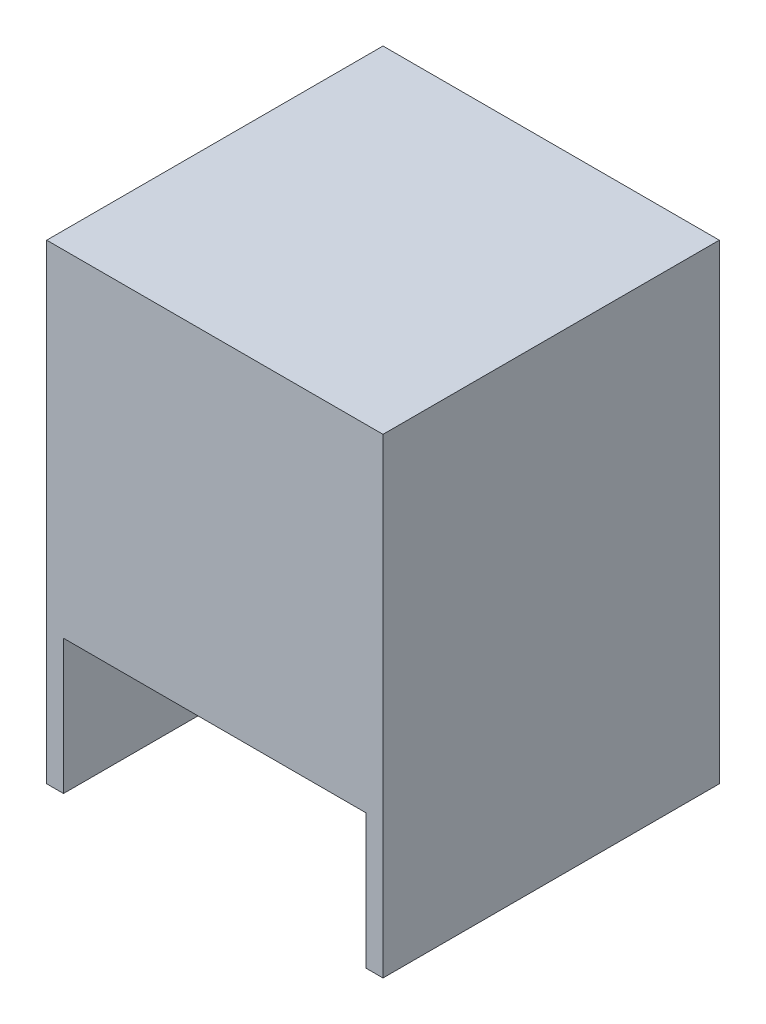
ISO-10303-21;
HEADER;
FILE_DESCRIPTION(('STEP AP214'),'2;1');
FILE_NAME('part.step','',(''),(''),'','','');
FILE_SCHEMA(('AUTOMOTIVE_DESIGN { 1 0 10303 214 1 1 1 1 }'));
ENDSEC;
DATA;
#1=APPLICATION_CONTEXT('core data for automotive mechanical design processes');
#2=APPLICATION_PROTOCOL_DEFINITION('international standard','automotive_design',2000,#1);
#3=PRODUCT_CONTEXT('',#1,'mechanical');
#4=PRODUCT('Part','Part','',(#3));
#5=PRODUCT_RELATED_PRODUCT_CATEGORY('part','',(#4));
#6=PRODUCT_DEFINITION_FORMATION('','',#4);
#7=PRODUCT_DEFINITION_CONTEXT('part definition',#1,'design');
#8=PRODUCT_DEFINITION('design','',#6,#7);
#9=PRODUCT_DEFINITION_SHAPE('','',#8);
#10=(LENGTH_UNIT() NAMED_UNIT(*) SI_UNIT(.MILLI.,.METRE.));
#11=(NAMED_UNIT(*) PLANE_ANGLE_UNIT() SI_UNIT($,.RADIAN.));
#12=(NAMED_UNIT(*) SI_UNIT($,.STERADIAN.) SOLID_ANGLE_UNIT());
#13=UNCERTAINTY_MEASURE_WITH_UNIT(LENGTH_MEASURE(1.E-05),#10,'distance_accuracy_value','');
#14=(GEOMETRIC_REPRESENTATION_CONTEXT(3) GLOBAL_UNCERTAINTY_ASSIGNED_CONTEXT((#13)) GLOBAL_UNIT_ASSIGNED_CONTEXT((#10,
#11,#12)) REPRESENTATION_CONTEXT('',''));
#15=CARTESIAN_POINT('',(0.,0.,0.));
#16=DIRECTION('',(0.,0.,1.));
#17=DIRECTION('',(1.,0.,0.));
#18=AXIS2_PLACEMENT_3D('',#15,#16,#17);
#19=CARTESIAN_POINT('',(0.,0.,0.));
#20=DIRECTION('',(0.,1.,0.));
#21=DIRECTION('',(0.,0.,1.));
#22=AXIS2_PLACEMENT_3D('',#19,#20,#21);
#23=PLANE('',#22);
#24=DIRECTION('',(0.,0.,-1.));
#25=VECTOR('',#24,1.);
#26=CARTESIAN_POINT('',(450.,0.,500.));
#27=LINE('',#26,#25);
#28=CARTESIAN_POINT('',(450.,0.,500.));
#29=VERTEX_POINT('',#28);
#30=CARTESIAN_POINT('',(450.,0.,-500.));
#31=VERTEX_POINT('',#30);
#32=EDGE_CURVE('E122',#29,#31,#27,.T.);
#33=ORIENTED_EDGE('',*,*,#32,.F.);
#34=DIRECTION('',(1.,0.,0.));
#35=VECTOR('',#34,1.);
#36=CARTESIAN_POINT('',(-500.,0.,500.));
#37=LINE('',#36,#35);
#38=CARTESIAN_POINT('',(-450.,0.,500.));
#39=VERTEX_POINT('',#38);
#40=EDGE_CURVE('E152',#39,#29,#37,.T.);
#41=ORIENTED_EDGE('',*,*,#40,.F.);
#42=DIRECTION('',(0.,0.,1.));
#43=VECTOR('',#42,1.);
#44=CARTESIAN_POINT('',(-450.,0.,500.));
#45=LINE('',#44,#43);
#46=CARTESIAN_POINT('',(-450.,0.,-500.));
#47=VERTEX_POINT('',#46);
#48=EDGE_CURVE('E131',#47,#39,#45,.T.);
#49=ORIENTED_EDGE('',*,*,#48,.F.);
#50=DIRECTION('',(-1.,0.,0.));
#51=VECTOR('',#50,1.);
#52=CARTESIAN_POINT('',(-500.,0.,-500.));
#53=LINE('',#52,#51);
#54=EDGE_CURVE('E48',#31,#47,#53,.T.);
#55=ORIENTED_EDGE('',*,*,#54,.F.);
#56=EDGE_LOOP('',(#33,#41,#49,#55));
#57=FACE_BOUND('',#56,.T.);
#58=ADVANCED_FACE('F33',(#57),#23,.F.);
#59=CARTESIAN_POINT('',(500.,1000.,-500.));
#60=DIRECTION('',(-1.,0.,0.));
#61=DIRECTION('',(0.,0.,1.));
#62=AXIS2_PLACEMENT_3D('',#59,#60,#61);
#63=PLANE('',#62);
#64=DIRECTION('',(0.,-1.,0.));
#65=VECTOR('',#64,1.);
#66=CARTESIAN_POINT('',(500.,1000.,500.));
#67=LINE('',#66,#65);
#68=CARTESIAN_POINT('',(500.,1000.,500.));
#69=VERTEX_POINT('',#68);
#70=CARTESIAN_POINT('',(500.,-400.,500.));
#71=VERTEX_POINT('',#70);
#72=EDGE_CURVE('E100',#69,#71,#67,.T.);
#73=ORIENTED_EDGE('',*,*,#72,.T.);
#74=DIRECTION('',(0.,0.,1.));
#75=VECTOR('',#74,1.);
#76=CARTESIAN_POINT('',(500.,-400.,500.));
#77=LINE('',#76,#75);
#78=CARTESIAN_POINT('',(500.,-400.,-500.));
#79=VERTEX_POINT('',#78);
#80=EDGE_CURVE('E104',#79,#71,#77,.T.);
#81=ORIENTED_EDGE('',*,*,#80,.F.);
#82=DIRECTION('',(0.,-1.,0.));
#83=VECTOR('',#82,1.);
#84=CARTESIAN_POINT('',(500.,1000.,-500.));
#85=LINE('',#84,#83);
#86=CARTESIAN_POINT('',(500.,1000.,-500.));
#87=VERTEX_POINT('',#86);
#88=EDGE_CURVE('E11',#87,#79,#85,.T.);
#89=ORIENTED_EDGE('',*,*,#88,.F.);
#90=DIRECTION('',(0.,0.,-1.));
#91=VECTOR('',#90,1.);
#92=CARTESIAN_POINT('',(500.,1000.,-500.));
#93=LINE('',#92,#91);
#94=EDGE_CURVE('E105',#69,#87,#93,.T.);
#95=ORIENTED_EDGE('',*,*,#94,.F.);
#96=EDGE_LOOP('',(#73,#81,#89,#95));
#97=FACE_BOUND('',#96,.T.);
#98=ADVANCED_FACE('F35',(#97),#63,.F.);
#99=CARTESIAN_POINT('',(-500.,1000.,-500.));
#100=DIRECTION('',(0.,0.,1.));
#101=DIRECTION('',(1.,0.,0.));
#102=AXIS2_PLACEMENT_3D('',#99,#100,#101);
#103=PLANE('',#102);
#104=ORIENTED_EDGE('',*,*,#88,.T.);
#105=DIRECTION('',(1.,0.,0.));
#106=VECTOR('',#105,1.);
#107=CARTESIAN_POINT('',(500.,-400.,-500.));
#108=LINE('',#107,#106);
#109=CARTESIAN_POINT('',(450.,-400.,-500.));
#110=VERTEX_POINT('',#109);
#111=EDGE_CURVE('E121',#110,#79,#108,.T.);
#112=ORIENTED_EDGE('',*,*,#111,.F.);
#113=DIRECTION('',(0.,1.,0.));
#114=VECTOR('',#113,1.);
#115=CARTESIAN_POINT('',(450.,-400.,-500.));
#116=LINE('',#115,#114);
#117=EDGE_CURVE('E127',#110,#31,#116,.T.);
#118=ORIENTED_EDGE('',*,*,#117,.T.);
#119=ORIENTED_EDGE('',*,*,#54,.T.);
#120=DIRECTION('',(0.,1.,0.));
#121=VECTOR('',#120,1.);
#122=CARTESIAN_POINT('',(-450.,-400.,-500.));
#123=LINE('',#122,#121);
#124=CARTESIAN_POINT('',(-450.,-400.,-500.));
#125=VERTEX_POINT('',#124);
#126=EDGE_CURVE('E147',#125,#47,#123,.T.);
#127=ORIENTED_EDGE('',*,*,#126,.F.);
#128=DIRECTION('',(1.,0.,0.));
#129=VECTOR('',#128,1.);
#130=CARTESIAN_POINT('',(-500.,-400.,-500.));
#131=LINE('',#130,#129);
#132=CARTESIAN_POINT('',(-500.,-400.,-500.));
#133=VERTEX_POINT('',#132);
#134=EDGE_CURVE('E135',#133,#125,#131,.T.);
#135=ORIENTED_EDGE('',*,*,#134,.F.);
#136=DIRECTION('',(0.,-1.,0.));
#137=VECTOR('',#136,1.);
#138=CARTESIAN_POINT('',(-500.,1000.,-500.));
#139=LINE('',#138,#137);
#140=CARTESIAN_POINT('',(-500.,1000.,-500.));
#141=VERTEX_POINT('',#140);
#142=EDGE_CURVE('E41',#141,#133,#139,.T.);
#143=ORIENTED_EDGE('',*,*,#142,.F.);
#144=DIRECTION('',(-1.,0.,0.));
#145=VECTOR('',#144,1.);
#146=CARTESIAN_POINT('',(-500.,1000.,-500.));
#147=LINE('',#146,#145);
#148=EDGE_CURVE('E151',#87,#141,#147,.T.);
#149=ORIENTED_EDGE('',*,*,#148,.F.);
#150=EDGE_LOOP('',(#104,#112,#118,#119,#127,#135,#143,#149));
#151=FACE_BOUND('',#150,.T.);
#152=ADVANCED_FACE('F166',(#151),#103,.F.);
#153=CARTESIAN_POINT('',(-500.,1000.,-500.));
#154=DIRECTION('',(1.,0.,0.));
#155=DIRECTION('',(0.,0.,-1.));
#156=AXIS2_PLACEMENT_3D('',#153,#154,#155);
#157=PLANE('',#156);
#158=ORIENTED_EDGE('',*,*,#142,.T.);
#159=DIRECTION('',(0.,0.,-1.));
#160=VECTOR('',#159,1.);
#161=CARTESIAN_POINT('',(-500.,-400.,500.));
#162=LINE('',#161,#160);
#163=CARTESIAN_POINT('',(-500.,-400.,500.));
#164=VERTEX_POINT('',#163);
#165=EDGE_CURVE('E132',#164,#133,#162,.T.);
#166=ORIENTED_EDGE('',*,*,#165,.F.);
#167=DIRECTION('',(0.,-1.,0.));
#168=VECTOR('',#167,1.);
#169=CARTESIAN_POINT('',(-500.,1000.,500.));
#170=LINE('',#169,#168);
#171=CARTESIAN_POINT('',(-500.,1000.,500.));
#172=VERTEX_POINT('',#171);
#173=EDGE_CURVE('E107',#172,#164,#170,.T.);
#174=ORIENTED_EDGE('',*,*,#173,.F.);
#175=DIRECTION('',(0.,0.,1.));
#176=VECTOR('',#175,1.);
#177=CARTESIAN_POINT('',(-500.,1000.,-500.));
#178=LINE('',#177,#176);
#179=EDGE_CURVE('E154',#141,#172,#178,.T.);
#180=ORIENTED_EDGE('',*,*,#179,.F.);
#181=EDGE_LOOP('',(#158,#166,#174,#180));
#182=FACE_BOUND('',#181,.T.);
#183=ADVANCED_FACE('F164',(#182),#157,.F.);
#184=CARTESIAN_POINT('',(-500.,1000.,500.));
#185=DIRECTION('',(0.,0.,-1.));
#186=DIRECTION('',(-1.,0.,0.));
#187=AXIS2_PLACEMENT_3D('',#184,#185,#186);
#188=PLANE('',#187);
#189=ORIENTED_EDGE('',*,*,#173,.T.);
#190=DIRECTION('',(-1.,0.,0.));
#191=VECTOR('',#190,1.);
#192=CARTESIAN_POINT('',(-500.,-400.,500.));
#193=LINE('',#192,#191);
#194=CARTESIAN_POINT('',(-450.,-400.,500.));
#195=VERTEX_POINT('',#194);
#196=EDGE_CURVE('E139',#195,#164,#193,.T.);
#197=ORIENTED_EDGE('',*,*,#196,.F.);
#198=DIRECTION('',(0.,1.,0.));
#199=VECTOR('',#198,1.);
#200=CARTESIAN_POINT('',(-450.,-400.,500.));
#201=LINE('',#200,#199);
#202=EDGE_CURVE('E142',#195,#39,#201,.T.);
#203=ORIENTED_EDGE('',*,*,#202,.T.);
#204=ORIENTED_EDGE('',*,*,#40,.T.);
#205=DIRECTION('',(0.,1.,0.));
#206=VECTOR('',#205,1.);
#207=CARTESIAN_POINT('',(450.,-400.,500.));
#208=LINE('',#207,#206);
#209=CARTESIAN_POINT('',(450.,-400.,500.));
#210=VERTEX_POINT('',#209);
#211=EDGE_CURVE('E113',#210,#29,#208,.T.);
#212=ORIENTED_EDGE('',*,*,#211,.F.);
#213=DIRECTION('',(-1.,0.,0.));
#214=VECTOR('',#213,1.);
#215=CARTESIAN_POINT('',(500.,-400.,500.));
#216=LINE('',#215,#214);
#217=EDGE_CURVE('E110',#71,#210,#216,.T.);
#218=ORIENTED_EDGE('',*,*,#217,.F.);
#219=ORIENTED_EDGE('',*,*,#72,.F.);
#220=DIRECTION('',(1.,0.,0.));
#221=VECTOR('',#220,1.);
#222=CARTESIAN_POINT('',(-500.,1000.,500.));
#223=LINE('',#222,#221);
#224=EDGE_CURVE('E56',#172,#69,#223,.T.);
#225=ORIENTED_EDGE('',*,*,#224,.F.);
#226=EDGE_LOOP('',(#189,#197,#203,#204,#212,#218,#219,#225));
#227=FACE_BOUND('',#226,.T.);
#228=ADVANCED_FACE('F111',(#227),#188,.F.);
#229=CARTESIAN_POINT('',(0.,1000.,0.));
#230=DIRECTION('',(0.,1.,0.));
#231=DIRECTION('',(0.,0.,1.));
#232=AXIS2_PLACEMENT_3D('',#229,#230,#231);
#233=PLANE('',#232);
#234=ORIENTED_EDGE('',*,*,#94,.T.);
#235=ORIENTED_EDGE('',*,*,#148,.T.);
#236=ORIENTED_EDGE('',*,*,#179,.T.);
#237=ORIENTED_EDGE('',*,*,#224,.T.);
#238=EDGE_LOOP('',(#234,#235,#236,#237));
#239=FACE_BOUND('',#238,.T.);
#240=ADVANCED_FACE('F179',(#239),#233,.T.);
#241=CARTESIAN_POINT('',(-450.,-400.,500.));
#242=DIRECTION('',(-1.,0.,0.));
#243=DIRECTION('',(0.,0.,1.));
#244=AXIS2_PLACEMENT_3D('',#241,#242,#243);
#245=PLANE('',#244);
#246=ORIENTED_EDGE('',*,*,#48,.T.);
#247=ORIENTED_EDGE('',*,*,#202,.F.);
#248=DIRECTION('',(0.,0.,1.));
#249=VECTOR('',#248,1.);
#250=CARTESIAN_POINT('',(-450.,-400.,500.));
#251=LINE('',#250,#249);
#252=EDGE_CURVE('E137',#125,#195,#251,.T.);
#253=ORIENTED_EDGE('',*,*,#252,.F.);
#254=ORIENTED_EDGE('',*,*,#126,.T.);
#255=EDGE_LOOP('',(#246,#247,#253,#254));
#256=FACE_BOUND('',#255,.T.);
#257=ADVANCED_FACE('F173',(#256),#245,.F.);
#258=CARTESIAN_POINT('',(0.,-400.,0.));
#259=DIRECTION('',(0.,-1.,0.));
#260=DIRECTION('',(0.,0.,-1.));
#261=AXIS2_PLACEMENT_3D('',#258,#259,#260);
#262=PLANE('',#261);
#263=ORIENTED_EDGE('',*,*,#165,.T.);
#264=ORIENTED_EDGE('',*,*,#134,.T.);
#265=ORIENTED_EDGE('',*,*,#252,.T.);
#266=ORIENTED_EDGE('',*,*,#196,.T.);
#267=EDGE_LOOP('',(#263,#264,#265,#266));
#268=FACE_BOUND('',#267,.T.);
#269=ADVANCED_FACE('F169',(#268),#262,.T.);
#270=CARTESIAN_POINT('',(450.,-400.,500.));
#271=DIRECTION('',(1.,0.,0.));
#272=DIRECTION('',(0.,0.,-1.));
#273=AXIS2_PLACEMENT_3D('',#270,#271,#272);
#274=PLANE('',#273);
#275=ORIENTED_EDGE('',*,*,#32,.T.);
#276=ORIENTED_EDGE('',*,*,#117,.F.);
#277=DIRECTION('',(0.,0.,-1.));
#278=VECTOR('',#277,1.);
#279=CARTESIAN_POINT('',(450.,-400.,500.));
#280=LINE('',#279,#278);
#281=EDGE_CURVE('E116',#210,#110,#280,.T.);
#282=ORIENTED_EDGE('',*,*,#281,.F.);
#283=ORIENTED_EDGE('',*,*,#211,.T.);
#284=EDGE_LOOP('',(#275,#276,#282,#283));
#285=FACE_BOUND('',#284,.T.);
#286=ADVANCED_FACE('F178',(#285),#274,.F.);
#287=CARTESIAN_POINT('',(0.,-400.,0.));
#288=DIRECTION('',(0.,1.,0.));
#289=DIRECTION('',(0.,0.,1.));
#290=AXIS2_PLACEMENT_3D('',#287,#288,#289);
#291=PLANE('',#290);
#292=ORIENTED_EDGE('',*,*,#80,.T.);
#293=ORIENTED_EDGE('',*,*,#217,.T.);
#294=ORIENTED_EDGE('',*,*,#281,.T.);
#295=ORIENTED_EDGE('',*,*,#111,.T.);
#296=EDGE_LOOP('',(#292,#293,#294,#295));
#297=FACE_BOUND('',#296,.T.);
#298=ADVANCED_FACE('F119',(#297),#291,.F.);
#299=CLOSED_SHELL('',(#58,#98,#152,#183,#228,#240,#257,#269,#286,#298));
#300=MANIFOLD_SOLID_BREP('B2',#299);
#301=ADVANCED_BREP_SHAPE_REPRESENTATION('',(#18,#300),#14);
#302=SHAPE_DEFINITION_REPRESENTATION(#9,#301);
ENDSEC;
END-ISO-10303-21;
